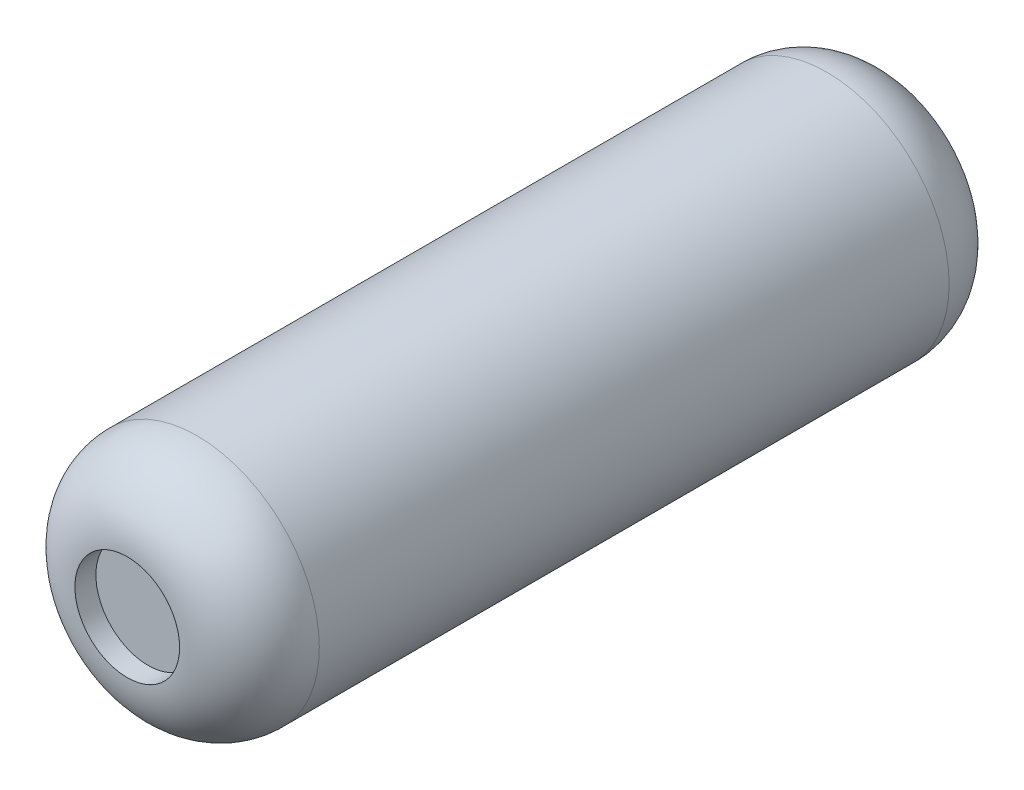
ISO-10303-21;
HEADER;
FILE_DESCRIPTION(('STEP AP214'),'2;1');
FILE_NAME('part.step','',(''),(''),'','','');
FILE_SCHEMA(('AUTOMOTIVE_DESIGN { 1 0 10303 214 1 1 1 1 }'));
ENDSEC;
DATA;
#1=APPLICATION_CONTEXT('core data for automotive mechanical design processes');
#2=APPLICATION_PROTOCOL_DEFINITION('international standard','automotive_design',2000,#1);
#3=PRODUCT_CONTEXT('',#1,'mechanical');
#4=PRODUCT('Part','Part','',(#3));
#5=PRODUCT_RELATED_PRODUCT_CATEGORY('part','',(#4));
#6=PRODUCT_DEFINITION_FORMATION('','',#4);
#7=PRODUCT_DEFINITION_CONTEXT('part definition',#1,'design');
#8=PRODUCT_DEFINITION('design','',#6,#7);
#9=PRODUCT_DEFINITION_SHAPE('','',#8);
#10=(LENGTH_UNIT() NAMED_UNIT(*) SI_UNIT(.MILLI.,.METRE.));
#11=(NAMED_UNIT(*) PLANE_ANGLE_UNIT() SI_UNIT($,.RADIAN.));
#12=(NAMED_UNIT(*) SI_UNIT($,.STERADIAN.) SOLID_ANGLE_UNIT());
#13=UNCERTAINTY_MEASURE_WITH_UNIT(LENGTH_MEASURE(1.E-05),#10,'distance_accuracy_value','');
#14=(GEOMETRIC_REPRESENTATION_CONTEXT(3) GLOBAL_UNCERTAINTY_ASSIGNED_CONTEXT((#13)) GLOBAL_UNIT_ASSIGNED_CONTEXT((#10,
#11,#12)) REPRESENTATION_CONTEXT('',''));
#15=CARTESIAN_POINT('',(0.,0.,0.));
#16=DIRECTION('',(0.,0.,1.));
#17=DIRECTION('',(1.,0.,0.));
#18=AXIS2_PLACEMENT_3D('',#15,#16,#17);
#19=CARTESIAN_POINT('',(0.,0.,280.));
#20=DIRECTION('',(0.,0.,-1.));
#21=DIRECTION('',(-1.,0.,0.));
#22=AXIS2_PLACEMENT_3D('',#19,#20,#21);
#23=CYLINDRICAL_SURFACE('',#22,44.4904458598726);
#24=CARTESIAN_POINT('',(0.,0.,25.4));
#25=DIRECTION('',(0.,0.,1.));
#26=DIRECTION('',(1.,0.,0.));
#27=AXIS2_PLACEMENT_3D('',#24,#25,#26);
#28=CIRCLE('',#27,44.4904458598726);
#29=CARTESIAN_POINT('',(44.4904458598726,0.,25.4));
#30=VERTEX_POINT('',#29);
#31=EDGE_CURVE('E140',#30,#30,#28,.T.);
#32=ORIENTED_EDGE('',*,*,#31,.T.);
#33=EDGE_LOOP('',(#32));
#34=FACE_BOUND('',#33,.T.);
#35=CARTESIAN_POINT('',(0.,0.,254.6));
#36=DIRECTION('',(0.,0.,1.));
#37=DIRECTION('',(1.,0.,0.));
#38=AXIS2_PLACEMENT_3D('',#35,#36,#37);
#39=CIRCLE('',#38,44.4904458598726);
#40=CARTESIAN_POINT('',(44.4904458598726,0.,254.6));
#41=VERTEX_POINT('',#40);
#42=EDGE_CURVE('E132',#41,#41,#39,.F.);
#43=ORIENTED_EDGE('',*,*,#42,.T.);
#44=EDGE_LOOP('',(#43));
#45=FACE_BOUND('',#44,.T.);
#46=ADVANCED_FACE('F43',(#34,#45),#23,.T.);
#47=CARTESIAN_POINT('',(0.,0.,280.));
#48=DIRECTION('',(0.,0.,1.));
#49=DIRECTION('',(1.,0.,0.));
#50=AXIS2_PLACEMENT_3D('',#47,#48,#49);
#51=PLANE('',#50);
#52=CARTESIAN_POINT('',(0.,0.,280.));
#53=DIRECTION('',(0.,0.,1.));
#54=DIRECTION('',(1.,0.,0.));
#55=AXIS2_PLACEMENT_3D('',#52,#53,#54);
#56=CIRCLE('',#55,19.05);
#57=CARTESIAN_POINT('',(19.05,0.,280.));
#58=VERTEX_POINT('',#57);
#59=EDGE_CURVE('E198',#58,#58,#56,.T.);
#60=ORIENTED_EDGE('',*,*,#59,.F.);
#61=EDGE_LOOP('',(#60));
#62=FACE_BOUND('',#61,.T.);
#63=CARTESIAN_POINT('',(0.,0.,280.));
#64=DIRECTION('',(0.,0.,1.));
#65=DIRECTION('',(1.,0.,0.));
#66=AXIS2_PLACEMENT_3D('',#63,#64,#65);
#67=CIRCLE('',#66,19.0904458598726);
#68=CARTESIAN_POINT('',(19.0904458598726,0.,280.));
#69=VERTEX_POINT('',#68);
#70=EDGE_CURVE('E11',#69,#69,#67,.T.);
#71=ORIENTED_EDGE('',*,*,#70,.T.);
#72=EDGE_LOOP('',(#71));
#73=FACE_BOUND('',#72,.T.);
#74=ADVANCED_FACE('F156',(#62,#73),#51,.T.);
#75=CARTESIAN_POINT('',(0.,0.,0.));
#76=DIRECTION('',(0.,0.,1.));
#77=DIRECTION('',(1.,0.,0.));
#78=AXIS2_PLACEMENT_3D('',#75,#76,#77);
#79=PLANE('',#78);
#80=DIRECTION('',(1.,0.,0.));
#81=VECTOR('',#80,1.);
#82=CARTESIAN_POINT('',(10.,5.,0.));
#83=LINE('',#82,#81);
#84=CARTESIAN_POINT('',(-10.,5.,0.));
#85=VERTEX_POINT('',#84);
#86=CARTESIAN_POINT('',(10.,5.,0.));
#87=VERTEX_POINT('',#86);
#88=EDGE_CURVE('E94',#85,#87,#83,.T.);
#89=ORIENTED_EDGE('',*,*,#88,.F.);
#90=DIRECTION('',(0.,1.,0.));
#91=VECTOR('',#90,1.);
#92=CARTESIAN_POINT('',(-10.,5.,0.));
#93=LINE('',#92,#91);
#94=CARTESIAN_POINT('',(-10.,-5.,0.));
#95=VERTEX_POINT('',#94);
#96=EDGE_CURVE('E59',#95,#85,#93,.T.);
#97=ORIENTED_EDGE('',*,*,#96,.F.);
#98=DIRECTION('',(-1.,0.,0.));
#99=VECTOR('',#98,1.);
#100=CARTESIAN_POINT('',(10.,-5.,0.));
#101=LINE('',#100,#99);
#102=CARTESIAN_POINT('',(10.,-5.,0.));
#103=VERTEX_POINT('',#102);
#104=EDGE_CURVE('E114',#103,#95,#101,.T.);
#105=ORIENTED_EDGE('',*,*,#104,.F.);
#106=DIRECTION('',(0.,-1.,0.));
#107=VECTOR('',#106,1.);
#108=CARTESIAN_POINT('',(10.,5.,0.));
#109=LINE('',#108,#107);
#110=EDGE_CURVE('E125',#87,#103,#109,.T.);
#111=ORIENTED_EDGE('',*,*,#110,.F.);
#112=EDGE_LOOP('',(#89,#97,#105,#111));
#113=FACE_BOUND('',#112,.T.);
#114=CARTESIAN_POINT('',(0.,0.,0.));
#115=DIRECTION('',(0.,0.,1.));
#116=DIRECTION('',(1.,0.,0.));
#117=AXIS2_PLACEMENT_3D('',#114,#115,#116);
#118=CIRCLE('',#117,19.0904458598726);
#119=CARTESIAN_POINT('',(19.0904458598726,0.,0.));
#120=VERTEX_POINT('',#119);
#121=EDGE_CURVE('E52',#120,#120,#118,.F.);
#122=ORIENTED_EDGE('',*,*,#121,.T.);
#123=EDGE_LOOP('',(#122));
#124=FACE_BOUND('',#123,.T.);
#125=ADVANCED_FACE('F147',(#113,#124),#79,.F.);
#126=CARTESIAN_POINT('',(0.,0.,25.4));
#127=DIRECTION('',(0.,0.,1.));
#128=DIRECTION('',(1.,0.,0.));
#129=AXIS2_PLACEMENT_3D('',#126,#127,#128);
#130=DEGENERATE_TOROIDAL_SURFACE('',#129,19.0904458598726,25.4,.T.);
#131=ORIENTED_EDGE('',*,*,#121,.F.);
#132=EDGE_LOOP('',(#131));
#133=FACE_BOUND('',#132,.T.);
#134=ORIENTED_EDGE('',*,*,#31,.F.);
#135=EDGE_LOOP('',(#134));
#136=FACE_BOUND('',#135,.T.);
#137=ADVANCED_FACE('F149',(#133,#136),#130,.T.);
#138=CARTESIAN_POINT('',(0.,0.,254.6));
#139=DIRECTION('',(0.,0.,1.));
#140=DIRECTION('',(1.,0.,0.));
#141=AXIS2_PLACEMENT_3D('',#138,#139,#140);
#142=DEGENERATE_TOROIDAL_SURFACE('',#141,19.0904458598726,25.4,.T.);
#143=ORIENTED_EDGE('',*,*,#42,.F.);
#144=EDGE_LOOP('',(#143));
#145=FACE_BOUND('',#144,.T.);
#146=ORIENTED_EDGE('',*,*,#70,.F.);
#147=EDGE_LOOP('',(#146));
#148=FACE_BOUND('',#147,.T.);
#149=ADVANCED_FACE('F45',(#145,#148),#142,.T.);
#150=CARTESIAN_POINT('',(-10.,5.,7.62));
#151=DIRECTION('',(-1.,0.,0.));
#152=DIRECTION('',(0.,-1.,0.));
#153=AXIS2_PLACEMENT_3D('',#150,#151,#152);
#154=PLANE('',#153);
#155=ORIENTED_EDGE('',*,*,#96,.T.);
#156=DIRECTION('',(0.,0.,-1.));
#157=VECTOR('',#156,1.);
#158=CARTESIAN_POINT('',(-10.,5.,7.62));
#159=LINE('',#158,#157);
#160=CARTESIAN_POINT('',(-10.,5.,7.62));
#161=VERTEX_POINT('',#160);
#162=EDGE_CURVE('E82',#161,#85,#159,.T.);
#163=ORIENTED_EDGE('',*,*,#162,.F.);
#164=DIRECTION('',(0.,1.,0.));
#165=VECTOR('',#164,1.);
#166=CARTESIAN_POINT('',(-10.,5.,7.62));
#167=LINE('',#166,#165);
#168=CARTESIAN_POINT('',(-10.,-5.,7.62));
#169=VERTEX_POINT('',#168);
#170=EDGE_CURVE('E110',#169,#161,#167,.T.);
#171=ORIENTED_EDGE('',*,*,#170,.F.);
#172=DIRECTION('',(0.,0.,-1.));
#173=VECTOR('',#172,1.);
#174=CARTESIAN_POINT('',(-10.,-5.,7.62));
#175=LINE('',#174,#173);
#176=EDGE_CURVE('E67',#169,#95,#175,.T.);
#177=ORIENTED_EDGE('',*,*,#176,.T.);
#178=EDGE_LOOP('',(#155,#163,#171,#177));
#179=FACE_BOUND('',#178,.T.);
#180=ADVANCED_FACE('F162',(#179),#154,.F.);
#181=CARTESIAN_POINT('',(10.,-5.,7.62));
#182=DIRECTION('',(0.,-1.,0.));
#183=DIRECTION('',(0.,0.,-1.));
#184=AXIS2_PLACEMENT_3D('',#181,#182,#183);
#185=PLANE('',#184);
#186=ORIENTED_EDGE('',*,*,#104,.T.);
#187=ORIENTED_EDGE('',*,*,#176,.F.);
#188=DIRECTION('',(-1.,0.,0.));
#189=VECTOR('',#188,1.);
#190=CARTESIAN_POINT('',(10.,-5.,7.62));
#191=LINE('',#190,#189);
#192=CARTESIAN_POINT('',(10.,-5.,7.62));
#193=VERTEX_POINT('',#192);
#194=EDGE_CURVE('E107',#193,#169,#191,.T.);
#195=ORIENTED_EDGE('',*,*,#194,.F.);
#196=DIRECTION('',(0.,0.,-1.));
#197=VECTOR('',#196,1.);
#198=CARTESIAN_POINT('',(10.,-5.,7.62));
#199=LINE('',#198,#197);
#200=EDGE_CURVE('E99',#193,#103,#199,.T.);
#201=ORIENTED_EDGE('',*,*,#200,.T.);
#202=EDGE_LOOP('',(#186,#187,#195,#201));
#203=FACE_BOUND('',#202,.T.);
#204=ADVANCED_FACE('F179',(#203),#185,.F.);
#205=CARTESIAN_POINT('',(10.,5.,7.62));
#206=DIRECTION('',(1.,0.,0.));
#207=DIRECTION('',(0.,1.,0.));
#208=AXIS2_PLACEMENT_3D('',#205,#206,#207);
#209=PLANE('',#208);
#210=ORIENTED_EDGE('',*,*,#110,.T.);
#211=ORIENTED_EDGE('',*,*,#200,.F.);
#212=DIRECTION('',(0.,-1.,0.));
#213=VECTOR('',#212,1.);
#214=CARTESIAN_POINT('',(10.,5.,7.62));
#215=LINE('',#214,#213);
#216=CARTESIAN_POINT('',(10.,5.,7.62));
#217=VERTEX_POINT('',#216);
#218=EDGE_CURVE('E102',#217,#193,#215,.T.);
#219=ORIENTED_EDGE('',*,*,#218,.F.);
#220=DIRECTION('',(0.,0.,-1.));
#221=VECTOR('',#220,1.);
#222=CARTESIAN_POINT('',(10.,5.,7.62));
#223=LINE('',#222,#221);
#224=EDGE_CURVE('E87',#217,#87,#223,.T.);
#225=ORIENTED_EDGE('',*,*,#224,.T.);
#226=EDGE_LOOP('',(#210,#211,#219,#225));
#227=FACE_BOUND('',#226,.T.);
#228=ADVANCED_FACE('F103',(#227),#209,.F.);
#229=CARTESIAN_POINT('',(10.,5.,7.62));
#230=DIRECTION('',(0.,1.,0.));
#231=DIRECTION('',(0.,0.,1.));
#232=AXIS2_PLACEMENT_3D('',#229,#230,#231);
#233=PLANE('',#232);
#234=ORIENTED_EDGE('',*,*,#88,.T.);
#235=ORIENTED_EDGE('',*,*,#224,.F.);
#236=DIRECTION('',(1.,0.,0.));
#237=VECTOR('',#236,1.);
#238=CARTESIAN_POINT('',(10.,5.,7.62));
#239=LINE('',#238,#237);
#240=EDGE_CURVE('E91',#161,#217,#239,.T.);
#241=ORIENTED_EDGE('',*,*,#240,.F.);
#242=ORIENTED_EDGE('',*,*,#162,.T.);
#243=EDGE_LOOP('',(#234,#235,#241,#242));
#244=FACE_BOUND('',#243,.T.);
#245=ADVANCED_FACE('F89',(#244),#233,.F.);
#246=CARTESIAN_POINT('',(0.,0.,7.62));
#247=DIRECTION('',(0.,0.,-1.));
#248=DIRECTION('',(-1.,0.,0.));
#249=AXIS2_PLACEMENT_3D('',#246,#247,#248);
#250=PLANE('',#249);
#251=ORIENTED_EDGE('',*,*,#170,.T.);
#252=ORIENTED_EDGE('',*,*,#240,.T.);
#253=ORIENTED_EDGE('',*,*,#218,.T.);
#254=ORIENTED_EDGE('',*,*,#194,.T.);
#255=EDGE_LOOP('',(#251,#252,#253,#254));
#256=FACE_BOUND('',#255,.T.);
#257=ADVANCED_FACE('F109',(#256),#250,.T.);
#258=CARTESIAN_POINT('',(0.,0.,272.38));
#259=DIRECTION('',(0.,0.,1.));
#260=DIRECTION('',(1.,0.,0.));
#261=AXIS2_PLACEMENT_3D('',#258,#259,#260);
#262=CYLINDRICAL_SURFACE('',#261,19.05);
#263=CARTESIAN_POINT('',(0.,0.,272.38));
#264=DIRECTION('',(0.,0.,1.));
#265=DIRECTION('',(1.,0.,0.));
#266=AXIS2_PLACEMENT_3D('',#263,#264,#265);
#267=CIRCLE('',#266,19.05);
#268=CARTESIAN_POINT('',(19.05,0.,272.38));
#269=VERTEX_POINT('',#268);
#270=EDGE_CURVE('E122',#269,#269,#267,.T.);
#271=CARTESIAN_POINT('',(19.05,0.,272.38));
#272=CARTESIAN_POINT('',(19.05,0.,272.459375));
#273=CARTESIAN_POINT('',(19.05,0.,272.53875));
#274=CARTESIAN_POINT('',(19.05,0.,272.6975));
#275=CARTESIAN_POINT('',(19.05,0.,272.776875));
#276=CARTESIAN_POINT('',(19.05,0.,272.935625));
#277=CARTESIAN_POINT('',(19.05,0.,273.015));
#278=CARTESIAN_POINT('',(19.05,0.,273.17375));
#279=CARTESIAN_POINT('',(19.05,0.,273.253125));
#280=CARTESIAN_POINT('',(19.05,0.,273.411875));
#281=CARTESIAN_POINT('',(19.05,0.,273.49125));
#282=CARTESIAN_POINT('',(19.05,0.,273.65));
#283=CARTESIAN_POINT('',(19.05,0.,273.729375));
#284=CARTESIAN_POINT('',(19.05,0.,273.888125));
#285=CARTESIAN_POINT('',(19.05,0.,273.9675));
#286=CARTESIAN_POINT('',(19.05,0.,274.12625));
#287=CARTESIAN_POINT('',(19.05,0.,274.205625));
#288=CARTESIAN_POINT('',(19.05,0.,274.364375));
#289=CARTESIAN_POINT('',(19.05,0.,274.44375));
#290=CARTESIAN_POINT('',(19.05,0.,274.6025));
#291=CARTESIAN_POINT('',(19.05,0.,274.681875));
#292=CARTESIAN_POINT('',(19.05,0.,274.840625));
#293=CARTESIAN_POINT('',(19.05,0.,274.92));
#294=CARTESIAN_POINT('',(19.05,0.,275.07875));
#295=CARTESIAN_POINT('',(19.05,0.,275.158125));
#296=CARTESIAN_POINT('',(19.05,0.,275.316875));
#297=CARTESIAN_POINT('',(19.05,0.,275.39625));
#298=CARTESIAN_POINT('',(19.05,0.,275.555));
#299=CARTESIAN_POINT('',(19.05,0.,275.634375));
#300=CARTESIAN_POINT('',(19.05,0.,275.793125));
#301=CARTESIAN_POINT('',(19.05,0.,275.8725));
#302=CARTESIAN_POINT('',(19.05,0.,276.03125));
#303=CARTESIAN_POINT('',(19.05,0.,276.110625));
#304=CARTESIAN_POINT('',(19.05,0.,276.269375));
#305=CARTESIAN_POINT('',(19.05,0.,276.34875));
#306=CARTESIAN_POINT('',(19.05,0.,276.5075));
#307=CARTESIAN_POINT('',(19.05,0.,276.586875));
#308=CARTESIAN_POINT('',(19.05,0.,276.745625));
#309=CARTESIAN_POINT('',(19.05,0.,276.825));
#310=CARTESIAN_POINT('',(19.05,0.,276.98375));
#311=CARTESIAN_POINT('',(19.05,0.,277.063125));
#312=CARTESIAN_POINT('',(19.05,0.,277.221875));
#313=CARTESIAN_POINT('',(19.05,0.,277.30125));
#314=CARTESIAN_POINT('',(19.05,0.,277.46));
#315=CARTESIAN_POINT('',(19.05,0.,277.539375));
#316=CARTESIAN_POINT('',(19.05,0.,277.698125));
#317=CARTESIAN_POINT('',(19.05,0.,277.7775));
#318=CARTESIAN_POINT('',(19.05,0.,277.93625));
#319=CARTESIAN_POINT('',(19.05,0.,278.015625));
#320=CARTESIAN_POINT('',(19.05,0.,278.174375));
#321=CARTESIAN_POINT('',(19.05,0.,278.25375));
#322=CARTESIAN_POINT('',(19.05,0.,278.4125));
#323=CARTESIAN_POINT('',(19.05,0.,278.491875));
#324=CARTESIAN_POINT('',(19.05,0.,278.650625));
#325=CARTESIAN_POINT('',(19.05,0.,278.73));
#326=CARTESIAN_POINT('',(19.05,0.,278.88875));
#327=CARTESIAN_POINT('',(19.05,0.,278.968125));
#328=CARTESIAN_POINT('',(19.05,0.,279.126875));
#329=CARTESIAN_POINT('',(19.05,0.,279.20625));
#330=CARTESIAN_POINT('',(19.05,0.,279.365));
#331=CARTESIAN_POINT('',(19.05,0.,279.444375));
#332=CARTESIAN_POINT('',(19.05,0.,279.603125));
#333=CARTESIAN_POINT('',(19.05,0.,279.6825));
#334=CARTESIAN_POINT('',(19.05,0.,279.84125));
#335=CARTESIAN_POINT('',(19.05,0.,279.920625));
#336=CARTESIAN_POINT('',(19.05,0.,280.));
#337=B_SPLINE_CURVE_WITH_KNOTS('',3,(#271,#272,#273,#274,#275,#276,#277,#278,#279,#280,#281,
#282,#283,#284,#285,#286,#287,#288,#289,#290,#291,#292,#293,#294,#295,#296,#297,#298,#299,#300,
#301,#302,#303,#304,#305,#306,#307,#308,#309,#310,#311,#312,#313,#314,#315,#316,#317,#318,#319,
#320,#321,#322,#323,#324,#325,#326,#327,#328,#329,#330,#331,#332,#333,#334,#335,#336),
.UNSPECIFIED.,.F.,.F.,(4,2,2,2,2,2,2,2,2,2,2,2,2,2,2,2,2,2,2,2,2,2,2,2,2,2,2,2,2,2,2,2,4),(0.,
0.238125000000033,0.476250000000011,0.714375000000045,0.952500000000023,1.19062500000006,
1.42875000000003,1.66687500000001,1.90500000000005,2.14312500000002,2.38125000000006,
2.61937500000003,2.85750000000001,3.09562500000005,3.33375000000002,3.57187500000006,
3.81000000000004,4.04812500000001,4.28625000000005,4.52437500000002,4.76250000000006,
5.00062500000004,5.23875000000001,5.47687500000005,5.71500000000003,5.95312500000006,
6.19125000000004,6.42937500000001,6.66750000000005,6.90562500000003,7.14375000000006,
7.38187500000004,7.62000000000002),.UNSPECIFIED.);
#338=EDGE_CURVE('BSEAM187',#269,#58,#337,.T.);
#339=ORIENTED_EDGE('',*,*,#270,.F.);
#340=ORIENTED_EDGE('',*,*,#59,.T.);
#341=ORIENTED_EDGE('',*,*,#338,.T.);
#342=ORIENTED_EDGE('',*,*,#338,.F.);
#343=EDGE_LOOP('',(#339,#341,#340,#342));
#344=FACE_BOUND('',#343,.T.);
#345=ADVANCED_FACE('F187',(#344),#262,.F.);
#346=CARTESIAN_POINT('',(0.,0.,272.38));
#347=DIRECTION('',(0.,0.,1.));
#348=DIRECTION('',(1.,0.,0.));
#349=AXIS2_PLACEMENT_3D('',#346,#347,#348);
#350=PLANE('',#349);
#351=ORIENTED_EDGE('',*,*,#270,.T.);
#352=EDGE_LOOP('',(#351));
#353=FACE_BOUND('',#352,.T.);
#354=ADVANCED_FACE('F189',(#353),#350,.T.);
#355=CLOSED_SHELL('',(#46,#74,#125,#137,#149,#180,#204,#228,#245,#257,#345,#354));
#356=MANIFOLD_SOLID_BREP('B2',#355);
#357=ADVANCED_BREP_SHAPE_REPRESENTATION('',(#18,#356),#14);
#358=SHAPE_DEFINITION_REPRESENTATION(#9,#357);
ENDSEC;
END-ISO-10303-21;
